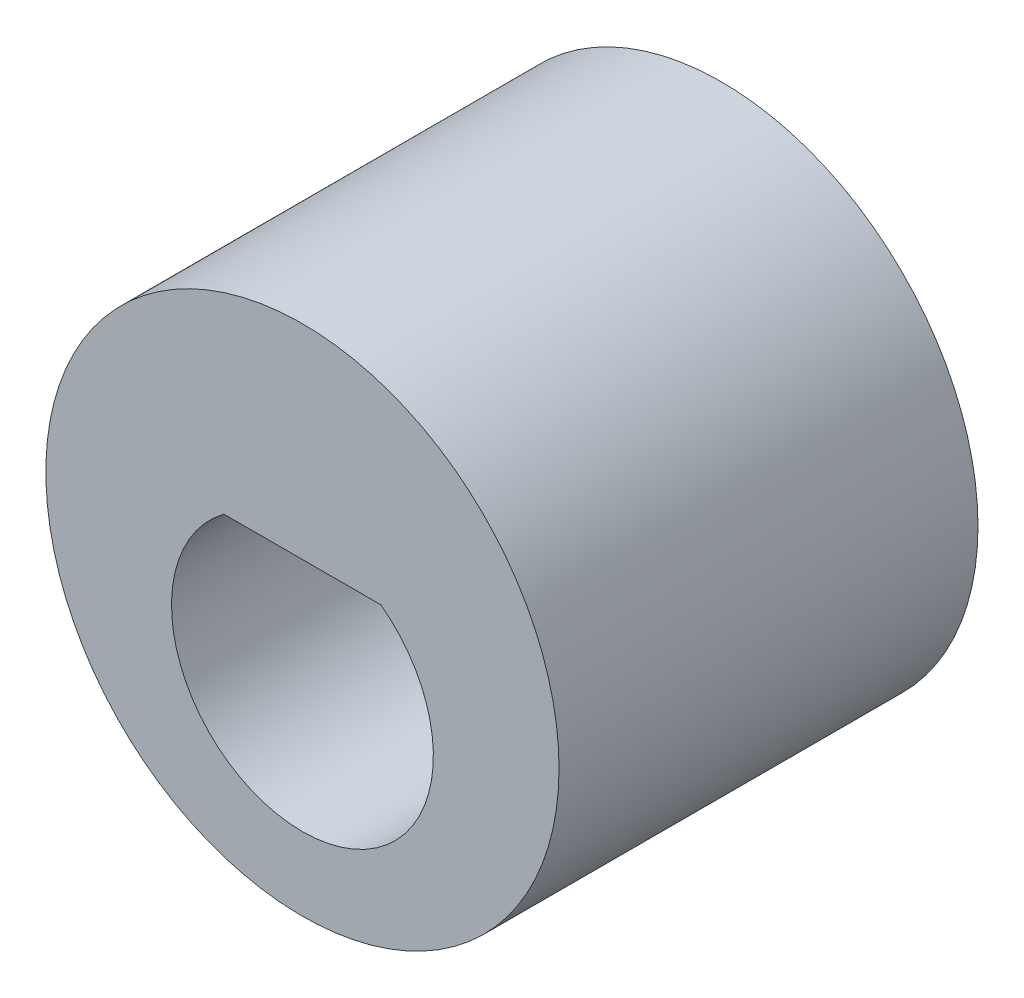
ISO-10303-21;
HEADER;
FILE_DESCRIPTION(('STEP AP214'),'2;1');
FILE_NAME('part.step','',(''),(''),'','','');
FILE_SCHEMA(('AUTOMOTIVE_DESIGN { 1 0 10303 214 1 1 1 1 }'));
ENDSEC;
DATA;
#1=APPLICATION_CONTEXT('core data for automotive mechanical design processes');
#2=APPLICATION_PROTOCOL_DEFINITION('international standard','automotive_design',2000,#1);
#3=PRODUCT_CONTEXT('',#1,'mechanical');
#4=PRODUCT('Part','Part','',(#3));
#5=PRODUCT_RELATED_PRODUCT_CATEGORY('part','',(#4));
#6=PRODUCT_DEFINITION_FORMATION('','',#4);
#7=PRODUCT_DEFINITION_CONTEXT('part definition',#1,'design');
#8=PRODUCT_DEFINITION('design','',#6,#7);
#9=PRODUCT_DEFINITION_SHAPE('','',#8);
#10=(LENGTH_UNIT() NAMED_UNIT(*) SI_UNIT(.MILLI.,.METRE.));
#11=(NAMED_UNIT(*) PLANE_ANGLE_UNIT() SI_UNIT($,.RADIAN.));
#12=(NAMED_UNIT(*) SI_UNIT($,.STERADIAN.) SOLID_ANGLE_UNIT());
#13=UNCERTAINTY_MEASURE_WITH_UNIT(LENGTH_MEASURE(1.E-05),#10,'distance_accuracy_value','');
#14=(GEOMETRIC_REPRESENTATION_CONTEXT(3) GLOBAL_UNCERTAINTY_ASSIGNED_CONTEXT((#13)) GLOBAL_UNIT_ASSIGNED_CONTEXT((#10,
#11,#12)) REPRESENTATION_CONTEXT('',''));
#15=CARTESIAN_POINT('',(0.,0.,0.));
#16=DIRECTION('',(0.,0.,1.));
#17=DIRECTION('',(1.,0.,0.));
#18=AXIS2_PLACEMENT_3D('',#15,#16,#17);
#19=CARTESIAN_POINT('',(0.,0.,8.));
#20=DIRECTION('',(0.,0.,-1.));
#21=DIRECTION('',(-1.,0.,0.));
#22=AXIS2_PLACEMENT_3D('',#19,#20,#21);
#23=CYLINDRICAL_SURFACE('',#22,2.5);
#24=CARTESIAN_POINT('',(0.,0.,0.));
#25=DIRECTION('',(0.,0.,1.));
#26=DIRECTION('',(1.,0.,0.));
#27=AXIS2_PLACEMENT_3D('',#24,#25,#26);
#28=CIRCLE('',#27,2.5);
#29=CARTESIAN_POINT('',(-1.5,2.,0.));
#30=VERTEX_POINT('',#29);
#31=CARTESIAN_POINT('',(1.5,2.,0.));
#32=VERTEX_POINT('',#31);
#33=EDGE_CURVE('E63',#30,#32,#28,.T.);
#34=ORIENTED_EDGE('',*,*,#33,.F.);
#35=DIRECTION('',(0.,0.,-1.));
#36=VECTOR('',#35,1.);
#37=CARTESIAN_POINT('',(-1.5,2.,8.));
#38=LINE('',#37,#36);
#39=CARTESIAN_POINT('',(-1.5,2.,8.));
#40=VERTEX_POINT('',#39);
#41=EDGE_CURVE('E11',#40,#30,#38,.T.);
#42=ORIENTED_EDGE('',*,*,#41,.F.);
#43=CARTESIAN_POINT('',(0.,0.,8.));
#44=DIRECTION('',(0.,0.,1.));
#45=DIRECTION('',(1.,0.,0.));
#46=AXIS2_PLACEMENT_3D('',#43,#44,#45);
#47=CIRCLE('',#46,2.5);
#48=CARTESIAN_POINT('',(1.5,2.,8.));
#49=VERTEX_POINT('',#48);
#50=EDGE_CURVE('E64',#40,#49,#47,.T.);
#51=ORIENTED_EDGE('',*,*,#50,.T.);
#52=DIRECTION('',(0.,0.,-1.));
#53=VECTOR('',#52,1.);
#54=CARTESIAN_POINT('',(1.5,2.,8.));
#55=LINE('',#54,#53);
#56=EDGE_CURVE('E43',#49,#32,#55,.T.);
#57=ORIENTED_EDGE('',*,*,#56,.T.);
#58=EDGE_LOOP('',(#34,#42,#51,#57));
#59=FACE_BOUND('',#58,.T.);
#60=ADVANCED_FACE('F35',(#59),#23,.F.);
#61=CARTESIAN_POINT('',(0.,2.,8.));
#62=DIRECTION('',(0.,1.,0.));
#63=DIRECTION('',(0.,0.,1.));
#64=AXIS2_PLACEMENT_3D('',#61,#62,#63);
#65=PLANE('',#64);
#66=DIRECTION('',(1.,0.,0.));
#67=VECTOR('',#66,1.);
#68=CARTESIAN_POINT('',(0.,2.,0.));
#69=LINE('',#68,#67);
#70=EDGE_CURVE('E66',#30,#32,#69,.T.);
#71=ORIENTED_EDGE('',*,*,#70,.T.);
#72=ORIENTED_EDGE('',*,*,#56,.F.);
#73=DIRECTION('',(1.,0.,0.));
#74=VECTOR('',#73,1.);
#75=CARTESIAN_POINT('',(0.,2.,8.));
#76=LINE('',#75,#74);
#77=EDGE_CURVE('E50',#40,#49,#76,.T.);
#78=ORIENTED_EDGE('',*,*,#77,.F.);
#79=ORIENTED_EDGE('',*,*,#41,.T.);
#80=EDGE_LOOP('',(#71,#72,#78,#79));
#81=FACE_BOUND('',#80,.T.);
#82=ADVANCED_FACE('F67',(#81),#65,.F.);
#83=CARTESIAN_POINT('',(0.,1.,8.));
#84=DIRECTION('',(0.,0.,-1.));
#85=DIRECTION('',(-1.,0.,0.));
#86=AXIS2_PLACEMENT_3D('',#83,#84,#85);
#87=CYLINDRICAL_SURFACE('',#86,4.9);
#88=CARTESIAN_POINT('',(0.,1.,8.));
#89=DIRECTION('',(0.,0.,1.));
#90=DIRECTION('',(1.,0.,0.));
#91=AXIS2_PLACEMENT_3D('',#88,#89,#90);
#92=CIRCLE('',#91,4.9);
#93=CARTESIAN_POINT('',(4.9,1.,8.));
#94=VERTEX_POINT('',#93);
#95=EDGE_CURVE('E65',#94,#94,#92,.T.);
#96=ORIENTED_EDGE('',*,*,#95,.F.);
#97=EDGE_LOOP('',(#96));
#98=FACE_BOUND('',#97,.T.);
#99=CARTESIAN_POINT('',(0.,1.,0.));
#100=DIRECTION('',(0.,0.,1.));
#101=DIRECTION('',(1.,0.,0.));
#102=AXIS2_PLACEMENT_3D('',#99,#100,#101);
#103=CIRCLE('',#102,4.9);
#104=CARTESIAN_POINT('',(4.9,1.,0.));
#105=VERTEX_POINT('',#104);
#106=EDGE_CURVE('E69',#105,#105,#103,.T.);
#107=ORIENTED_EDGE('',*,*,#106,.T.);
#108=EDGE_LOOP('',(#107));
#109=FACE_BOUND('',#108,.T.);
#110=ADVANCED_FACE('F86',(#98,#109),#87,.T.);
#111=CARTESIAN_POINT('',(0.,0.,8.));
#112=DIRECTION('',(0.,0.,1.));
#113=DIRECTION('',(1.,0.,0.));
#114=AXIS2_PLACEMENT_3D('',#111,#112,#113);
#115=PLANE('',#114);
#116=ORIENTED_EDGE('',*,*,#50,.F.);
#117=ORIENTED_EDGE('',*,*,#77,.T.);
#118=EDGE_LOOP('',(#116,#117));
#119=FACE_BOUND('',#118,.T.);
#120=ORIENTED_EDGE('',*,*,#95,.T.);
#121=EDGE_LOOP('',(#120));
#122=FACE_BOUND('',#121,.T.);
#123=ADVANCED_FACE('F84',(#119,#122),#115,.T.);
#124=CARTESIAN_POINT('',(0.,0.,0.));
#125=DIRECTION('',(0.,0.,1.));
#126=DIRECTION('',(1.,0.,0.));
#127=AXIS2_PLACEMENT_3D('',#124,#125,#126);
#128=PLANE('',#127);
#129=ORIENTED_EDGE('',*,*,#33,.T.);
#130=ORIENTED_EDGE('',*,*,#70,.F.);
#131=EDGE_LOOP('',(#129,#130));
#132=FACE_BOUND('',#131,.T.);
#133=ORIENTED_EDGE('',*,*,#106,.F.);
#134=EDGE_LOOP('',(#133));
#135=FACE_BOUND('',#134,.T.);
#136=ADVANCED_FACE('F71',(#132,#135),#128,.F.);
#137=CLOSED_SHELL('',(#60,#82,#110,#123,#136));
#138=MANIFOLD_SOLID_BREP('B2',#137);
#139=ADVANCED_BREP_SHAPE_REPRESENTATION('',(#18,#138),#14);
#140=SHAPE_DEFINITION_REPRESENTATION(#9,#139);
ENDSEC;
END-ISO-10303-21;
